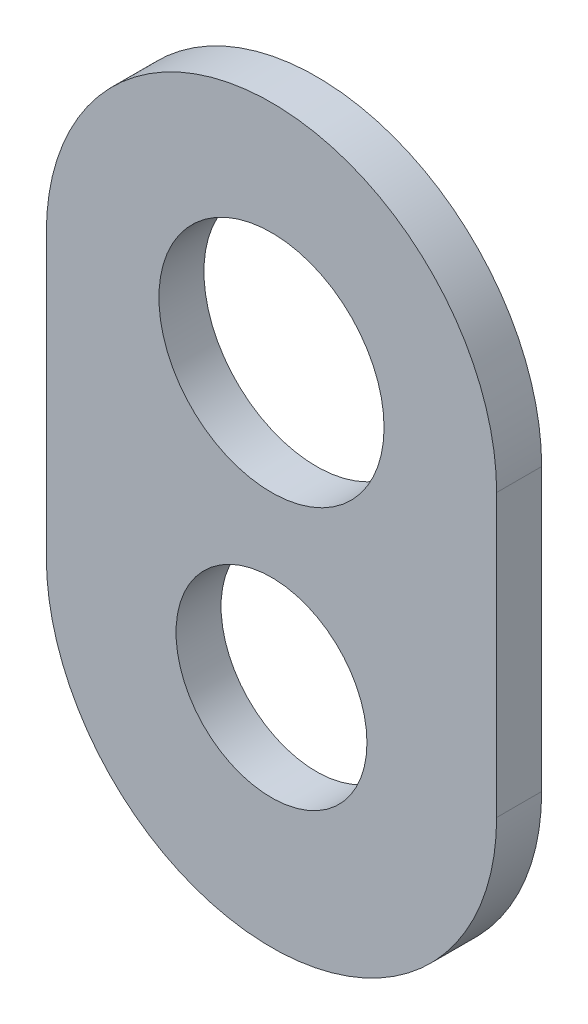
ISO-10303-21;
HEADER;
FILE_DESCRIPTION(('STEP AP214'),'2;1');
FILE_NAME('part.step','',(''),(''),'','','');
FILE_SCHEMA(('AUTOMOTIVE_DESIGN { 1 0 10303 214 1 1 1 1 }'));
ENDSEC;
DATA;
#1=APPLICATION_CONTEXT('core data for automotive mechanical design processes');
#2=APPLICATION_PROTOCOL_DEFINITION('international standard','automotive_design',2000,#1);
#3=PRODUCT_CONTEXT('',#1,'mechanical');
#4=PRODUCT('Part','Part','',(#3));
#5=PRODUCT_RELATED_PRODUCT_CATEGORY('part','',(#4));
#6=PRODUCT_DEFINITION_FORMATION('','',#4);
#7=PRODUCT_DEFINITION_CONTEXT('part definition',#1,'design');
#8=PRODUCT_DEFINITION('design','',#6,#7);
#9=PRODUCT_DEFINITION_SHAPE('','',#8);
#10=(LENGTH_UNIT() NAMED_UNIT(*) SI_UNIT(.MILLI.,.METRE.));
#11=(NAMED_UNIT(*) PLANE_ANGLE_UNIT() SI_UNIT($,.RADIAN.));
#12=(NAMED_UNIT(*) SI_UNIT($,.STERADIAN.) SOLID_ANGLE_UNIT());
#13=UNCERTAINTY_MEASURE_WITH_UNIT(LENGTH_MEASURE(1.E-05),#10,'distance_accuracy_value','');
#14=(GEOMETRIC_REPRESENTATION_CONTEXT(3) GLOBAL_UNCERTAINTY_ASSIGNED_CONTEXT((#13)) GLOBAL_UNIT_ASSIGNED_CONTEXT((#10,
#11,#12)) REPRESENTATION_CONTEXT('',''));
#15=CARTESIAN_POINT('',(0.,0.,0.));
#16=DIRECTION('',(0.,0.,1.));
#17=DIRECTION('',(1.,0.,0.));
#18=AXIS2_PLACEMENT_3D('',#15,#16,#17);
#19=CARTESIAN_POINT('',(0.,0.,5.08));
#20=DIRECTION('',(0.,0.,1.));
#21=DIRECTION('',(1.,0.,0.));
#22=AXIS2_PLACEMENT_3D('',#19,#20,#21);
#23=PLANE('',#22);
#24=CARTESIAN_POINT('',(0.,0.,5.08));
#25=DIRECTION('',(0.,0.,1.));
#26=DIRECTION('',(1.,0.,0.));
#27=AXIS2_PLACEMENT_3D('',#24,#25,#26);
#28=CIRCLE('',#27,12.7);
#29=CARTESIAN_POINT('',(12.7,0.,5.08));
#30=VERTEX_POINT('',#29);
#31=EDGE_CURVE('E113',#30,#30,#28,.T.);
#32=ORIENTED_EDGE('',*,*,#31,.F.);
#33=EDGE_LOOP('',(#32));
#34=FACE_BOUND('',#33,.T.);
#35=CARTESIAN_POINT('',(0.,0.,5.08));
#36=DIRECTION('',(0.,0.,1.));
#37=DIRECTION('',(1.,0.,0.));
#38=AXIS2_PLACEMENT_3D('',#35,#36,#37);
#39=CIRCLE('',#38,25.4);
#40=CARTESIAN_POINT('',(25.4,0.,5.08));
#41=VERTEX_POINT('',#40);
#42=CARTESIAN_POINT('',(-25.4,0.,5.08));
#43=VERTEX_POINT('',#42);
#44=EDGE_CURVE('E97',#41,#43,#39,.T.);
#45=ORIENTED_EDGE('',*,*,#44,.T.);
#46=DIRECTION('',(0.,-1.,0.));
#47=VECTOR('',#46,1.);
#48=CARTESIAN_POINT('',(-25.4,0.,5.08));
#49=LINE('',#48,#47);
#50=CARTESIAN_POINT('',(-25.4,-31.75,5.08));
#51=VERTEX_POINT('',#50);
#52=EDGE_CURVE('E94',#43,#51,#49,.T.);
#53=ORIENTED_EDGE('',*,*,#52,.T.);
#54=CARTESIAN_POINT('',(0.,-31.75,5.08));
#55=DIRECTION('',(0.,0.,1.));
#56=DIRECTION('',(1.,0.,0.));
#57=AXIS2_PLACEMENT_3D('',#54,#55,#56);
#58=CIRCLE('',#57,25.4);
#59=CARTESIAN_POINT('',(25.4,-31.75,5.08));
#60=VERTEX_POINT('',#59);
#61=EDGE_CURVE('E100',#51,#60,#58,.T.);
#62=ORIENTED_EDGE('',*,*,#61,.T.);
#63=DIRECTION('',(0.,1.,0.));
#64=VECTOR('',#63,1.);
#65=CARTESIAN_POINT('',(25.4,0.,5.08));
#66=LINE('',#65,#64);
#67=EDGE_CURVE('E61',#60,#41,#66,.T.);
#68=ORIENTED_EDGE('',*,*,#67,.T.);
#69=EDGE_LOOP('',(#45,#53,#62,#68));
#70=FACE_BOUND('',#69,.T.);
#71=CARTESIAN_POINT('',(0.,-31.75,5.08));
#72=DIRECTION('',(0.,0.,1.));
#73=DIRECTION('',(1.,0.,0.));
#74=AXIS2_PLACEMENT_3D('',#71,#72,#73);
#75=CIRCLE('',#74,10.7696);
#76=CARTESIAN_POINT('',(10.7696,-31.75,5.08));
#77=VERTEX_POINT('',#76);
#78=EDGE_CURVE('E128',#77,#77,#75,.T.);
#79=ORIENTED_EDGE('',*,*,#78,.F.);
#80=EDGE_LOOP('',(#79));
#81=FACE_BOUND('',#80,.T.);
#82=ADVANCED_FACE('F50',(#34,#70,#81),#23,.T.);
#83=CARTESIAN_POINT('',(0.,0.,0.));
#84=DIRECTION('',(0.,0.,1.));
#85=DIRECTION('',(1.,0.,0.));
#86=AXIS2_PLACEMENT_3D('',#83,#84,#85);
#87=PLANE('',#86);
#88=CARTESIAN_POINT('',(0.,0.,0.));
#89=DIRECTION('',(0.,0.,1.));
#90=DIRECTION('',(1.,0.,0.));
#91=AXIS2_PLACEMENT_3D('',#88,#89,#90);
#92=CIRCLE('',#91,25.4);
#93=CARTESIAN_POINT('',(25.4,0.,0.));
#94=VERTEX_POINT('',#93);
#95=CARTESIAN_POINT('',(-25.4,0.,0.));
#96=VERTEX_POINT('',#95);
#97=EDGE_CURVE('E115',#94,#96,#92,.T.);
#98=ORIENTED_EDGE('',*,*,#97,.F.);
#99=DIRECTION('',(0.,1.,0.));
#100=VECTOR('',#99,1.);
#101=CARTESIAN_POINT('',(25.4,0.,0.));
#102=LINE('',#101,#100);
#103=CARTESIAN_POINT('',(25.4,-31.75,0.));
#104=VERTEX_POINT('',#103);
#105=EDGE_CURVE('E87',#104,#94,#102,.T.);
#106=ORIENTED_EDGE('',*,*,#105,.F.);
#107=CARTESIAN_POINT('',(0.,-31.75,0.));
#108=DIRECTION('',(0.,0.,1.));
#109=DIRECTION('',(1.,0.,0.));
#110=AXIS2_PLACEMENT_3D('',#107,#108,#109);
#111=CIRCLE('',#110,25.4);
#112=CARTESIAN_POINT('',(-25.4,-31.75,0.));
#113=VERTEX_POINT('',#112);
#114=EDGE_CURVE('E83',#113,#104,#111,.T.);
#115=ORIENTED_EDGE('',*,*,#114,.F.);
#116=DIRECTION('',(0.,-1.,0.));
#117=VECTOR('',#116,1.);
#118=CARTESIAN_POINT('',(-25.4,0.,0.));
#119=LINE('',#118,#117);
#120=EDGE_CURVE('E103',#96,#113,#119,.T.);
#121=ORIENTED_EDGE('',*,*,#120,.F.);
#122=EDGE_LOOP('',(#98,#106,#115,#121));
#123=FACE_BOUND('',#122,.T.);
#124=CARTESIAN_POINT('',(0.,0.,0.));
#125=DIRECTION('',(0.,0.,1.));
#126=DIRECTION('',(1.,0.,0.));
#127=AXIS2_PLACEMENT_3D('',#124,#125,#126);
#128=CIRCLE('',#127,12.7);
#129=CARTESIAN_POINT('',(12.7,0.,0.));
#130=VERTEX_POINT('',#129);
#131=EDGE_CURVE('E130',#130,#130,#128,.T.);
#132=ORIENTED_EDGE('',*,*,#131,.T.);
#133=EDGE_LOOP('',(#132));
#134=FACE_BOUND('',#133,.T.);
#135=CARTESIAN_POINT('',(0.,-31.75,0.));
#136=DIRECTION('',(0.,0.,1.));
#137=DIRECTION('',(1.,0.,0.));
#138=AXIS2_PLACEMENT_3D('',#135,#136,#137);
#139=CIRCLE('',#138,10.7696);
#140=CARTESIAN_POINT('',(10.7696,-31.75,0.));
#141=VERTEX_POINT('',#140);
#142=EDGE_CURVE('E134',#141,#141,#139,.T.);
#143=ORIENTED_EDGE('',*,*,#142,.T.);
#144=EDGE_LOOP('',(#143));
#145=FACE_BOUND('',#144,.T.);
#146=ADVANCED_FACE('F121',(#123,#134,#145),#87,.F.);
#147=CARTESIAN_POINT('',(0.,0.,5.08));
#148=DIRECTION('',(0.,0.,-1.));
#149=DIRECTION('',(-1.,0.,0.));
#150=AXIS2_PLACEMENT_3D('',#147,#148,#149);
#151=CYLINDRICAL_SURFACE('',#150,25.4);
#152=ORIENTED_EDGE('',*,*,#97,.T.);
#153=DIRECTION('',(0.,0.,-1.));
#154=VECTOR('',#153,1.);
#155=CARTESIAN_POINT('',(-25.4,0.,5.08));
#156=LINE('',#155,#154);
#157=EDGE_CURVE('E12',#43,#96,#156,.T.);
#158=ORIENTED_EDGE('',*,*,#157,.F.);
#159=ORIENTED_EDGE('',*,*,#44,.F.);
#160=DIRECTION('',(0.,0.,-1.));
#161=VECTOR('',#160,1.);
#162=CARTESIAN_POINT('',(25.4,0.,5.08));
#163=LINE('',#162,#161);
#164=EDGE_CURVE('E107',#41,#94,#163,.T.);
#165=ORIENTED_EDGE('',*,*,#164,.T.);
#166=EDGE_LOOP('',(#152,#158,#159,#165));
#167=FACE_BOUND('',#166,.T.);
#168=ADVANCED_FACE('F47',(#167),#151,.T.);
#169=CARTESIAN_POINT('',(-25.4,0.,5.08));
#170=DIRECTION('',(1.,0.,0.));
#171=DIRECTION('',(0.,0.,-1.));
#172=AXIS2_PLACEMENT_3D('',#169,#170,#171);
#173=PLANE('',#172);
#174=ORIENTED_EDGE('',*,*,#120,.T.);
#175=DIRECTION('',(0.,0.,-1.));
#176=VECTOR('',#175,1.);
#177=CARTESIAN_POINT('',(-25.4,-31.75,5.08));
#178=LINE('',#177,#176);
#179=EDGE_CURVE('E57',#51,#113,#178,.T.);
#180=ORIENTED_EDGE('',*,*,#179,.F.);
#181=ORIENTED_EDGE('',*,*,#52,.F.);
#182=ORIENTED_EDGE('',*,*,#157,.T.);
#183=EDGE_LOOP('',(#174,#180,#181,#182));
#184=FACE_BOUND('',#183,.T.);
#185=ADVANCED_FACE('F105',(#184),#173,.F.);
#186=CARTESIAN_POINT('',(0.,-31.75,5.08));
#187=DIRECTION('',(0.,0.,-1.));
#188=DIRECTION('',(-1.,0.,0.));
#189=AXIS2_PLACEMENT_3D('',#186,#187,#188);
#190=CYLINDRICAL_SURFACE('',#189,25.4);
#191=ORIENTED_EDGE('',*,*,#114,.T.);
#192=DIRECTION('',(0.,0.,-1.));
#193=VECTOR('',#192,1.);
#194=CARTESIAN_POINT('',(25.4,-31.75,5.08));
#195=LINE('',#194,#193);
#196=EDGE_CURVE('E102',#60,#104,#195,.T.);
#197=ORIENTED_EDGE('',*,*,#196,.F.);
#198=ORIENTED_EDGE('',*,*,#61,.F.);
#199=ORIENTED_EDGE('',*,*,#179,.T.);
#200=EDGE_LOOP('',(#191,#197,#198,#199));
#201=FACE_BOUND('',#200,.T.);
#202=ADVANCED_FACE('F104',(#201),#190,.T.);
#203=CARTESIAN_POINT('',(25.4,0.,5.08));
#204=DIRECTION('',(-1.,0.,0.));
#205=DIRECTION('',(0.,0.,1.));
#206=AXIS2_PLACEMENT_3D('',#203,#204,#205);
#207=PLANE('',#206);
#208=ORIENTED_EDGE('',*,*,#105,.T.);
#209=ORIENTED_EDGE('',*,*,#164,.F.);
#210=ORIENTED_EDGE('',*,*,#67,.F.);
#211=ORIENTED_EDGE('',*,*,#196,.T.);
#212=EDGE_LOOP('',(#208,#209,#210,#211));
#213=FACE_BOUND('',#212,.T.);
#214=ADVANCED_FACE('F118',(#213),#207,.F.);
#215=CARTESIAN_POINT('',(0.,0.,5.08));
#216=DIRECTION('',(0.,0.,-1.));
#217=DIRECTION('',(-1.,0.,0.));
#218=AXIS2_PLACEMENT_3D('',#215,#216,#217);
#219=CYLINDRICAL_SURFACE('',#218,12.7);
#220=ORIENTED_EDGE('',*,*,#31,.T.);
#221=EDGE_LOOP('',(#220));
#222=FACE_BOUND('',#221,.T.);
#223=ORIENTED_EDGE('',*,*,#131,.F.);
#224=EDGE_LOOP('',(#223));
#225=FACE_BOUND('',#224,.T.);
#226=ADVANCED_FACE('F147',(#222,#225),#219,.F.);
#227=CARTESIAN_POINT('',(0.,-31.75,5.08));
#228=DIRECTION('',(0.,0.,-1.));
#229=DIRECTION('',(-1.,0.,0.));
#230=AXIS2_PLACEMENT_3D('',#227,#228,#229);
#231=CYLINDRICAL_SURFACE('',#230,10.7696);
#232=ORIENTED_EDGE('',*,*,#78,.T.);
#233=EDGE_LOOP('',(#232));
#234=FACE_BOUND('',#233,.T.);
#235=ORIENTED_EDGE('',*,*,#142,.F.);
#236=EDGE_LOOP('',(#235));
#237=FACE_BOUND('',#236,.T.);
#238=ADVANCED_FACE('F139',(#234,#237),#231,.F.);
#239=CLOSED_SHELL('',(#82,#146,#168,#185,#202,#214,#226,#238));
#240=MANIFOLD_SOLID_BREP('B2',#239);
#241=ADVANCED_BREP_SHAPE_REPRESENTATION('',(#18,#240),#14);
#242=SHAPE_DEFINITION_REPRESENTATION(#9,#241);
ENDSEC;
END-ISO-10303-21;
